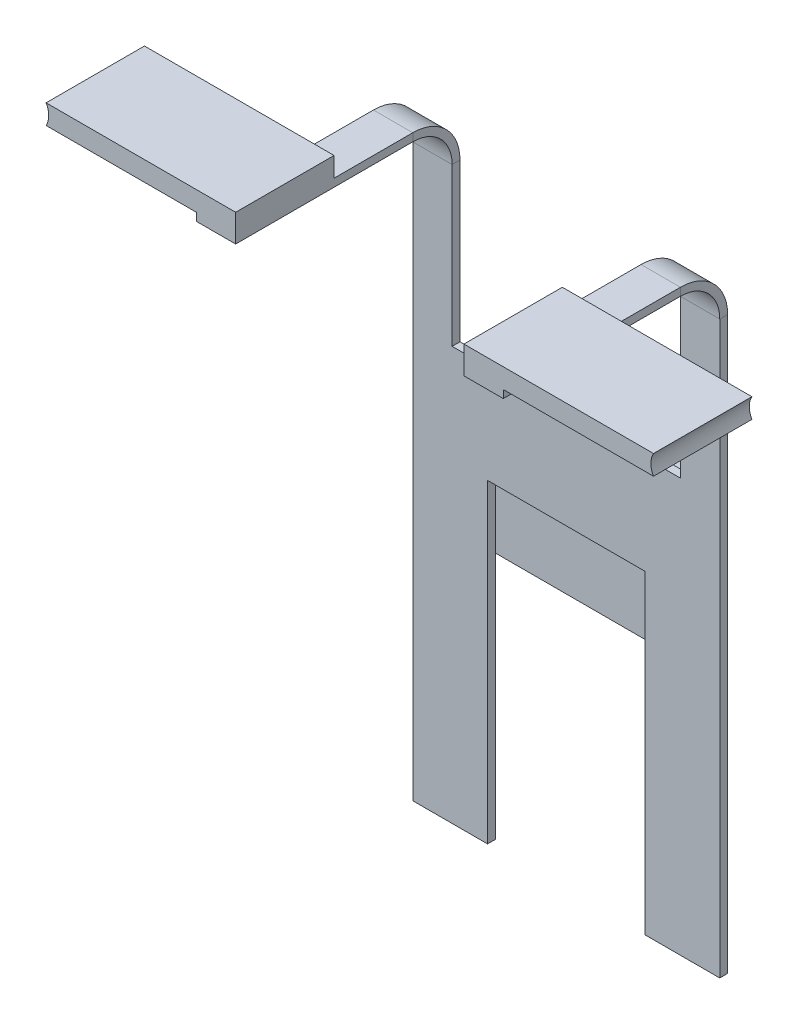
ISO-10303-21;
HEADER;
FILE_DESCRIPTION(('STEP AP214'),'2;1');
FILE_NAME('part.step','',(''),(''),'','','');
FILE_SCHEMA(('AUTOMOTIVE_DESIGN { 1 0 10303 214 1 1 1 1 }'));
ENDSEC;
DATA;
#1=APPLICATION_CONTEXT('core data for automotive mechanical design processes');
#2=APPLICATION_PROTOCOL_DEFINITION('international standard','automotive_design',2000,#1);
#3=PRODUCT_CONTEXT('',#1,'mechanical');
#4=PRODUCT('Part','Part','',(#3));
#5=PRODUCT_RELATED_PRODUCT_CATEGORY('part','',(#4));
#6=PRODUCT_DEFINITION_FORMATION('','',#4);
#7=PRODUCT_DEFINITION_CONTEXT('part definition',#1,'design');
#8=PRODUCT_DEFINITION('design','',#6,#7);
#9=PRODUCT_DEFINITION_SHAPE('','',#8);
#10=(LENGTH_UNIT() NAMED_UNIT(*) SI_UNIT(.MILLI.,.METRE.));
#11=(NAMED_UNIT(*) PLANE_ANGLE_UNIT() SI_UNIT($,.RADIAN.));
#12=(NAMED_UNIT(*) SI_UNIT($,.STERADIAN.) SOLID_ANGLE_UNIT());
#13=UNCERTAINTY_MEASURE_WITH_UNIT(LENGTH_MEASURE(1.E-05),#10,'distance_accuracy_value','');
#14=(GEOMETRIC_REPRESENTATION_CONTEXT(3) GLOBAL_UNCERTAINTY_ASSIGNED_CONTEXT((#13)) GLOBAL_UNIT_ASSIGNED_CONTEXT((#10,
#11,#12)) REPRESENTATION_CONTEXT('',''));
#15=CARTESIAN_POINT('',(0.,0.,0.));
#16=DIRECTION('',(0.,0.,1.));
#17=DIRECTION('',(1.,0.,0.));
#18=AXIS2_PLACEMENT_3D('',#15,#16,#17);
#19=CARTESIAN_POINT('',(78.,154.,24.));
#20=DIRECTION('',(0.,1.,0.));
#21=DIRECTION('',(-1.,0.,0.));
#22=AXIS2_PLACEMENT_3D('',#19,#20,#21);
#23=PLANE('',#22);
#24=DIRECTION('',(0.,0.,1.));
#25=VECTOR('',#24,1.);
#26=CARTESIAN_POINT('',(58.,154.,24.));
#27=LINE('',#26,#25);
#28=CARTESIAN_POINT('',(58.,154.,24.));
#29=VERTEX_POINT('',#28);
#30=CARTESIAN_POINT('',(58.,154.,63.9999999999999));
#31=VERTEX_POINT('',#30);
#32=EDGE_CURVE('E339',#29,#31,#27,.T.);
#33=ORIENTED_EDGE('',*,*,#32,.T.);
#34=DIRECTION('',(1.,0.,0.));
#35=VECTOR('',#34,1.);
#36=CARTESIAN_POINT('',(58.,154.,63.9999999999999));
#37=LINE('',#36,#35);
#38=CARTESIAN_POINT('',(78.,154.,63.9999999999999));
#39=VERTEX_POINT('',#38);
#40=EDGE_CURVE('E276',#31,#39,#37,.T.);
#41=ORIENTED_EDGE('',*,*,#40,.T.);
#42=DIRECTION('',(0.,0.,1.));
#43=VECTOR('',#42,1.);
#44=CARTESIAN_POINT('',(78.,154.,24.));
#45=LINE('',#44,#43);
#46=CARTESIAN_POINT('',(78.,154.,24.));
#47=VERTEX_POINT('',#46);
#48=EDGE_CURVE('E380',#47,#39,#45,.T.);
#49=ORIENTED_EDGE('',*,*,#48,.F.);
#50=DIRECTION('',(-1.,0.,0.));
#51=VECTOR('',#50,1.);
#52=CARTESIAN_POINT('',(78.,154.,24.));
#53=LINE('',#52,#51);
#54=EDGE_CURVE('E347',#47,#29,#53,.T.);
#55=ORIENTED_EDGE('',*,*,#54,.T.);
#56=EDGE_LOOP('',(#33,#41,#49,#55));
#57=FACE_BOUND('',#56,.T.);
#58=ADVANCED_FACE('F39',(#57),#23,.T.);
#59=CARTESIAN_POINT('',(-78.,50.,4.));
#60=DIRECTION('',(0.,-1.,0.));
#61=DIRECTION('',(0.,0.,-1.));
#62=AXIS2_PLACEMENT_3D('',#59,#60,#61);
#63=PLANE('',#62);
#64=DIRECTION('',(0.,0.,1.));
#65=VECTOR('',#64,1.);
#66=CARTESIAN_POINT('',(58.,50.,0.));
#67=LINE('',#66,#65);
#68=CARTESIAN_POINT('',(58.,50.,0.));
#69=VERTEX_POINT('',#68);
#70=CARTESIAN_POINT('',(58.,50.,4.));
#71=VERTEX_POINT('',#70);
#72=EDGE_CURVE('E304',#69,#71,#67,.T.);
#73=ORIENTED_EDGE('',*,*,#72,.F.);
#74=DIRECTION('',(-1.,0.,0.));
#75=VECTOR('',#74,1.);
#76=CARTESIAN_POINT('',(-78.,50.,0.));
#77=LINE('',#76,#75);
#78=CARTESIAN_POINT('',(-58.,50.,0.));
#79=VERTEX_POINT('',#78);
#80=EDGE_CURVE('E571',#69,#79,#77,.T.);
#81=ORIENTED_EDGE('',*,*,#80,.T.);
#82=DIRECTION('',(0.,0.,-1.));
#83=VECTOR('',#82,1.);
#84=CARTESIAN_POINT('',(-58.,50.,4.));
#85=LINE('',#84,#83);
#86=CARTESIAN_POINT('',(-58.,50.,4.));
#87=VERTEX_POINT('',#86);
#88=EDGE_CURVE('E384',#87,#79,#85,.T.);
#89=ORIENTED_EDGE('',*,*,#88,.F.);
#90=DIRECTION('',(-1.,0.,0.));
#91=VECTOR('',#90,1.);
#92=CARTESIAN_POINT('',(-78.,50.,4.));
#93=LINE('',#92,#91);
#94=EDGE_CURVE('E545',#71,#87,#93,.T.);
#95=ORIENTED_EDGE('',*,*,#94,.F.);
#96=EDGE_LOOP('',(#73,#81,#89,#95));
#97=FACE_BOUND('',#96,.T.);
#98=ADVANCED_FACE('F719',(#97),#63,.F.);
#99=CARTESIAN_POINT('',(0.,0.,0.));
#100=DIRECTION('',(0.,0.,1.));
#101=DIRECTION('',(1.,0.,0.));
#102=AXIS2_PLACEMENT_3D('',#99,#100,#101);
#103=PLANE('',#102);
#104=DIRECTION('',(-1.,0.,0.));
#105=VECTOR('',#104,1.);
#106=CARTESIAN_POINT('',(50.,-34.,0.));
#107=LINE('',#106,#105);
#108=CARTESIAN_POINT('',(50.,-34.,0.));
#109=VERTEX_POINT('',#108);
#110=CARTESIAN_POINT('',(40.,-34.,0.));
#111=VERTEX_POINT('',#110);
#112=EDGE_CURVE('E495',#109,#111,#107,.T.);
#113=ORIENTED_EDGE('',*,*,#112,.F.);
#114=DIRECTION('',(0.,-1.,0.));
#115=VECTOR('',#114,1.);
#116=CARTESIAN_POINT('',(50.,38.,0.));
#117=LINE('',#116,#115);
#118=CARTESIAN_POINT('',(50.,38.,0.));
#119=VERTEX_POINT('',#118);
#120=EDGE_CURVE('E475',#119,#109,#117,.T.);
#121=ORIENTED_EDGE('',*,*,#120,.F.);
#122=DIRECTION('',(1.,0.,0.));
#123=VECTOR('',#122,1.);
#124=CARTESIAN_POINT('',(50.,38.,0.));
#125=LINE('',#124,#123);
#126=CARTESIAN_POINT('',(-50.,38.,0.));
#127=VERTEX_POINT('',#126);
#128=EDGE_CURVE('E481',#127,#119,#125,.T.);
#129=ORIENTED_EDGE('',*,*,#128,.F.);
#130=DIRECTION('',(0.,1.,0.));
#131=VECTOR('',#130,1.);
#132=CARTESIAN_POINT('',(-50.,38.,0.));
#133=LINE('',#132,#131);
#134=CARTESIAN_POINT('',(-50.,-34.,0.));
#135=VERTEX_POINT('',#134);
#136=EDGE_CURVE('E499',#135,#127,#133,.T.);
#137=ORIENTED_EDGE('',*,*,#136,.F.);
#138=CARTESIAN_POINT('',(-40.,-34.,0.));
#139=VERTEX_POINT('',#138);
#140=EDGE_CURVE('E254',#139,#135,#107,.T.);
#141=ORIENTED_EDGE('',*,*,#140,.F.);
#142=DIRECTION('',(0.,1.,0.));
#143=VECTOR('',#142,1.);
#144=CARTESIAN_POINT('',(-40.,0.,0.));
#145=LINE('',#144,#143);
#146=CARTESIAN_POINT('',(-40.,-160.,0.));
#147=VERTEX_POINT('',#146);
#148=EDGE_CURVE('E552',#147,#139,#145,.T.);
#149=ORIENTED_EDGE('',*,*,#148,.F.);
#150=DIRECTION('',(1.,0.,0.));
#151=VECTOR('',#150,1.);
#152=CARTESIAN_POINT('',(-78.,-160.,0.));
#153=LINE('',#152,#151);
#154=CARTESIAN_POINT('',(-78.,-160.,0.));
#155=VERTEX_POINT('',#154);
#156=EDGE_CURVE('E521',#155,#147,#153,.T.);
#157=ORIENTED_EDGE('',*,*,#156,.F.);
#158=DIRECTION('',(0.,-1.,0.));
#159=VECTOR('',#158,1.);
#160=CARTESIAN_POINT('',(-78.,0.,0.));
#161=LINE('',#160,#159);
#162=CARTESIAN_POINT('',(-78.,130.,0.));
#163=VERTEX_POINT('',#162);
#164=EDGE_CURVE('E527',#163,#155,#161,.T.);
#165=ORIENTED_EDGE('',*,*,#164,.F.);
#166=DIRECTION('',(-1.,0.,0.));
#167=VECTOR('',#166,1.);
#168=CARTESIAN_POINT('',(-78.,130.,0.));
#169=LINE('',#168,#167);
#170=CARTESIAN_POINT('',(-58.,130.,0.));
#171=VERTEX_POINT('',#170);
#172=EDGE_CURVE('E403',#171,#163,#169,.T.);
#173=ORIENTED_EDGE('',*,*,#172,.F.);
#174=DIRECTION('',(0.,1.,0.));
#175=VECTOR('',#174,1.);
#176=CARTESIAN_POINT('',(-58.,50.,0.));
#177=LINE('',#176,#175);
#178=EDGE_CURVE('E399',#79,#171,#177,.T.);
#179=ORIENTED_EDGE('',*,*,#178,.F.);
#180=ORIENTED_EDGE('',*,*,#80,.F.);
#181=DIRECTION('',(0.,1.,0.));
#182=VECTOR('',#181,1.);
#183=CARTESIAN_POINT('',(58.,50.,0.));
#184=LINE('',#183,#182);
#185=CARTESIAN_POINT('',(58.,130.,0.));
#186=VERTEX_POINT('',#185);
#187=EDGE_CURVE('E308',#69,#186,#184,.T.);
#188=ORIENTED_EDGE('',*,*,#187,.T.);
#189=DIRECTION('',(-1.,0.,0.));
#190=VECTOR('',#189,1.);
#191=CARTESIAN_POINT('',(78.,130.,0.));
#192=LINE('',#191,#190);
#193=CARTESIAN_POINT('',(78.,130.,0.));
#194=VERTEX_POINT('',#193);
#195=EDGE_CURVE('E334',#194,#186,#192,.T.);
#196=ORIENTED_EDGE('',*,*,#195,.F.);
#197=DIRECTION('',(0.,1.,0.));
#198=VECTOR('',#197,1.);
#199=CARTESIAN_POINT('',(78.,0.,0.));
#200=LINE('',#199,#198);
#201=CARTESIAN_POINT('',(78.,-160.,0.));
#202=VERTEX_POINT('',#201);
#203=EDGE_CURVE('E568',#202,#194,#200,.T.);
#204=ORIENTED_EDGE('',*,*,#203,.F.);
#205=DIRECTION('',(1.,0.,0.));
#206=VECTOR('',#205,1.);
#207=CARTESIAN_POINT('',(78.,-160.,0.));
#208=LINE('',#207,#206);
#209=CARTESIAN_POINT('',(40.,-160.,0.));
#210=VERTEX_POINT('',#209);
#211=EDGE_CURVE('E564',#210,#202,#208,.T.);
#212=ORIENTED_EDGE('',*,*,#211,.F.);
#213=DIRECTION('',(0.,-1.,0.));
#214=VECTOR('',#213,1.);
#215=CARTESIAN_POINT('',(40.,0.,0.));
#216=LINE('',#215,#214);
#217=EDGE_CURVE('E559',#111,#210,#216,.T.);
#218=ORIENTED_EDGE('',*,*,#217,.F.);
#219=EDGE_LOOP('',(#113,#121,#129,#137,#141,#149,#157,#165,#173,#179,#180,#188,#196,#204,#212,#218));
#220=FACE_BOUND('',#219,.T.);
#221=ADVANCED_FACE('F627',(#220),#103,.F.);
#222=CARTESIAN_POINT('',(-78.,-160.,4.));
#223=DIRECTION('',(0.,1.,0.));
#224=DIRECTION('',(0.,0.,1.));
#225=AXIS2_PLACEMENT_3D('',#222,#223,#224);
#226=PLANE('',#225);
#227=ORIENTED_EDGE('',*,*,#156,.T.);
#228=DIRECTION('',(0.,0.,-1.));
#229=VECTOR('',#228,1.);
#230=CARTESIAN_POINT('',(-40.,-160.,4.));
#231=LINE('',#230,#229);
#232=CARTESIAN_POINT('',(-40.,-160.,4.));
#233=VERTEX_POINT('',#232);
#234=EDGE_CURVE('E591',#233,#147,#231,.T.);
#235=ORIENTED_EDGE('',*,*,#234,.F.);
#236=DIRECTION('',(1.,0.,0.));
#237=VECTOR('',#236,1.);
#238=CARTESIAN_POINT('',(-78.,-160.,4.));
#239=LINE('',#238,#237);
#240=CARTESIAN_POINT('',(-78.,-160.,4.));
#241=VERTEX_POINT('',#240);
#242=EDGE_CURVE('E526',#241,#233,#239,.T.);
#243=ORIENTED_EDGE('',*,*,#242,.F.);
#244=DIRECTION('',(0.,0.,-1.));
#245=VECTOR('',#244,1.);
#246=CARTESIAN_POINT('',(-78.,-160.,4.));
#247=LINE('',#246,#245);
#248=EDGE_CURVE('E595',#241,#155,#247,.T.);
#249=ORIENTED_EDGE('',*,*,#248,.T.);
#250=EDGE_LOOP('',(#227,#235,#243,#249));
#251=FACE_BOUND('',#250,.T.);
#252=ADVANCED_FACE('F41',(#251),#226,.F.);
#253=CARTESIAN_POINT('',(-40.,0.,4.));
#254=DIRECTION('',(-1.,0.,0.));
#255=DIRECTION('',(0.,-1.,0.));
#256=AXIS2_PLACEMENT_3D('',#253,#254,#255);
#257=PLANE('',#256);
#258=ORIENTED_EDGE('',*,*,#148,.T.);
#259=CARTESIAN_POINT('',(-40.,0.,0.));
#260=VERTEX_POINT('',#259);
#261=EDGE_CURVE('E551',#139,#260,#145,.T.);
#262=ORIENTED_EDGE('',*,*,#261,.T.);
#263=DIRECTION('',(0.,0.,-1.));
#264=VECTOR('',#263,1.);
#265=CARTESIAN_POINT('',(-40.,0.,4.));
#266=LINE('',#265,#264);
#267=CARTESIAN_POINT('',(-40.,0.,4.));
#268=VERTEX_POINT('',#267);
#269=EDGE_CURVE('E587',#268,#260,#266,.T.);
#270=ORIENTED_EDGE('',*,*,#269,.F.);
#271=DIRECTION('',(0.,1.,0.));
#272=VECTOR('',#271,1.);
#273=CARTESIAN_POINT('',(-40.,0.,4.));
#274=LINE('',#273,#272);
#275=EDGE_CURVE('E530',#233,#268,#274,.T.);
#276=ORIENTED_EDGE('',*,*,#275,.F.);
#277=ORIENTED_EDGE('',*,*,#234,.T.);
#278=EDGE_LOOP('',(#258,#262,#270,#276,#277));
#279=FACE_BOUND('',#278,.T.);
#280=ADVANCED_FACE('F808',(#279),#257,.F.);
#281=CARTESIAN_POINT('',(-40.,0.,4.));
#282=DIRECTION('',(0.,1.,0.));
#283=DIRECTION('',(-1.,0.,0.));
#284=AXIS2_PLACEMENT_3D('',#281,#282,#283);
#285=PLANE('',#284);
#286=DIRECTION('',(1.,0.,0.));
#287=VECTOR('',#286,1.);
#288=CARTESIAN_POINT('',(-40.,0.,0.));
#289=LINE('',#288,#287);
#290=CARTESIAN_POINT('',(40.,0.,0.));
#291=VERTEX_POINT('',#290);
#292=EDGE_CURVE('E556',#260,#291,#289,.T.);
#293=ORIENTED_EDGE('',*,*,#292,.T.);
#294=DIRECTION('',(0.,0.,-1.));
#295=VECTOR('',#294,1.);
#296=CARTESIAN_POINT('',(40.,0.,4.));
#297=LINE('',#296,#295);
#298=CARTESIAN_POINT('',(40.,0.,4.));
#299=VERTEX_POINT('',#298);
#300=EDGE_CURVE('E583',#299,#291,#297,.T.);
#301=ORIENTED_EDGE('',*,*,#300,.F.);
#302=DIRECTION('',(1.,0.,0.));
#303=VECTOR('',#302,1.);
#304=CARTESIAN_POINT('',(-40.,0.,4.));
#305=LINE('',#304,#303);
#306=EDGE_CURVE('E533',#268,#299,#305,.T.);
#307=ORIENTED_EDGE('',*,*,#306,.F.);
#308=ORIENTED_EDGE('',*,*,#269,.T.);
#309=EDGE_LOOP('',(#293,#301,#307,#308));
#310=FACE_BOUND('',#309,.T.);
#311=ADVANCED_FACE('F806',(#310),#285,.F.);
#312=CARTESIAN_POINT('',(40.,0.,4.));
#313=DIRECTION('',(1.,0.,0.));
#314=DIRECTION('',(0.,1.,0.));
#315=AXIS2_PLACEMENT_3D('',#312,#313,#314);
#316=PLANE('',#315);
#317=EDGE_CURVE('E560',#291,#111,#216,.T.);
#318=ORIENTED_EDGE('',*,*,#317,.T.);
#319=ORIENTED_EDGE('',*,*,#217,.T.);
#320=DIRECTION('',(0.,0.,-1.));
#321=VECTOR('',#320,1.);
#322=CARTESIAN_POINT('',(40.,-160.,4.));
#323=LINE('',#322,#321);
#324=CARTESIAN_POINT('',(40.,-160.,4.));
#325=VERTEX_POINT('',#324);
#326=EDGE_CURVE('E579',#325,#210,#323,.T.);
#327=ORIENTED_EDGE('',*,*,#326,.F.);
#328=DIRECTION('',(0.,-1.,0.));
#329=VECTOR('',#328,1.);
#330=CARTESIAN_POINT('',(40.,0.,4.));
#331=LINE('',#330,#329);
#332=EDGE_CURVE('E536',#299,#325,#331,.T.);
#333=ORIENTED_EDGE('',*,*,#332,.F.);
#334=ORIENTED_EDGE('',*,*,#300,.T.);
#335=EDGE_LOOP('',(#318,#319,#327,#333,#334));
#336=FACE_BOUND('',#335,.T.);
#337=ADVANCED_FACE('F619',(#336),#316,.F.);
#338=CARTESIAN_POINT('',(78.,-160.,4.));
#339=DIRECTION('',(0.,1.,0.));
#340=DIRECTION('',(0.,0.,1.));
#341=AXIS2_PLACEMENT_3D('',#338,#339,#340);
#342=PLANE('',#341);
#343=ORIENTED_EDGE('',*,*,#211,.T.);
#344=DIRECTION('',(0.,0.,-1.));
#345=VECTOR('',#344,1.);
#346=CARTESIAN_POINT('',(78.,-160.,4.));
#347=LINE('',#346,#345);
#348=CARTESIAN_POINT('',(78.,-160.,4.));
#349=VERTEX_POINT('',#348);
#350=EDGE_CURVE('E548',#349,#202,#347,.T.);
#351=ORIENTED_EDGE('',*,*,#350,.F.);
#352=DIRECTION('',(1.,0.,0.));
#353=VECTOR('',#352,1.);
#354=CARTESIAN_POINT('',(78.,-160.,4.));
#355=LINE('',#354,#353);
#356=EDGE_CURVE('E539',#325,#349,#355,.T.);
#357=ORIENTED_EDGE('',*,*,#356,.F.);
#358=ORIENTED_EDGE('',*,*,#326,.T.);
#359=EDGE_LOOP('',(#343,#351,#357,#358));
#360=FACE_BOUND('',#359,.T.);
#361=ADVANCED_FACE('F625',(#360),#342,.F.);
#362=CARTESIAN_POINT('',(78.,0.,4.));
#363=DIRECTION('',(-1.,0.,0.));
#364=DIRECTION('',(0.,0.,1.));
#365=AXIS2_PLACEMENT_3D('',#362,#363,#364);
#366=PLANE('',#365);
#367=ORIENTED_EDGE('',*,*,#203,.T.);
#368=DIRECTION('',(0.,0.,-1.));
#369=VECTOR('',#368,1.);
#370=CARTESIAN_POINT('',(78.,130.,0.));
#371=LINE('',#370,#369);
#372=CARTESIAN_POINT('',(78.,130.,4.));
#373=VERTEX_POINT('',#372);
#374=EDGE_CURVE('E351',#373,#194,#371,.T.);
#375=ORIENTED_EDGE('',*,*,#374,.F.);
#376=DIRECTION('',(0.,1.,0.));
#377=VECTOR('',#376,1.);
#378=CARTESIAN_POINT('',(78.,0.,4.));
#379=LINE('',#378,#377);
#380=EDGE_CURVE('E542',#349,#373,#379,.T.);
#381=ORIENTED_EDGE('',*,*,#380,.F.);
#382=ORIENTED_EDGE('',*,*,#350,.T.);
#383=EDGE_LOOP('',(#367,#375,#381,#382));
#384=FACE_BOUND('',#383,.T.);
#385=ADVANCED_FACE('F632',(#384),#366,.F.);
#386=CARTESIAN_POINT('',(-78.,0.,4.));
#387=DIRECTION('',(1.,0.,0.));
#388=DIRECTION('',(0.,0.,-1.));
#389=AXIS2_PLACEMENT_3D('',#386,#387,#388);
#390=PLANE('',#389);
#391=ORIENTED_EDGE('',*,*,#164,.T.);
#392=ORIENTED_EDGE('',*,*,#248,.F.);
#393=DIRECTION('',(0.,-1.,0.));
#394=VECTOR('',#393,1.);
#395=CARTESIAN_POINT('',(-78.,0.,4.));
#396=LINE('',#395,#394);
#397=CARTESIAN_POINT('',(-78.,130.,4.));
#398=VERTEX_POINT('',#397);
#399=EDGE_CURVE('E522',#398,#241,#396,.T.);
#400=ORIENTED_EDGE('',*,*,#399,.F.);
#401=DIRECTION('',(0.,0.,1.));
#402=VECTOR('',#401,1.);
#403=CARTESIAN_POINT('',(-78.,130.,4.));
#404=LINE('',#403,#402);
#405=EDGE_CURVE('E437',#163,#398,#404,.T.);
#406=ORIENTED_EDGE('',*,*,#405,.F.);
#407=EDGE_LOOP('',(#391,#392,#400,#406));
#408=FACE_BOUND('',#407,.T.);
#409=ADVANCED_FACE('F793',(#408),#390,.F.);
#410=CARTESIAN_POINT('',(0.,0.,4.));
#411=DIRECTION('',(0.,0.,1.));
#412=DIRECTION('',(1.,0.,0.));
#413=AXIS2_PLACEMENT_3D('',#410,#411,#412);
#414=PLANE('',#413);
#415=ORIENTED_EDGE('',*,*,#399,.T.);
#416=ORIENTED_EDGE('',*,*,#242,.T.);
#417=ORIENTED_EDGE('',*,*,#275,.T.);
#418=ORIENTED_EDGE('',*,*,#306,.T.);
#419=ORIENTED_EDGE('',*,*,#332,.T.);
#420=ORIENTED_EDGE('',*,*,#356,.T.);
#421=ORIENTED_EDGE('',*,*,#380,.T.);
#422=DIRECTION('',(1.,0.,0.));
#423=VECTOR('',#422,1.);
#424=CARTESIAN_POINT('',(78.,130.,4.));
#425=LINE('',#424,#423);
#426=CARTESIAN_POINT('',(58.,130.,4.));
#427=VERTEX_POINT('',#426);
#428=EDGE_CURVE('E317',#427,#373,#425,.T.);
#429=ORIENTED_EDGE('',*,*,#428,.F.);
#430=DIRECTION('',(0.,1.,0.));
#431=VECTOR('',#430,1.);
#432=CARTESIAN_POINT('',(58.,50.,4.));
#433=LINE('',#432,#431);
#434=EDGE_CURVE('E313',#71,#427,#433,.T.);
#435=ORIENTED_EDGE('',*,*,#434,.F.);
#436=ORIENTED_EDGE('',*,*,#94,.T.);
#437=DIRECTION('',(0.,1.,0.));
#438=VECTOR('',#437,1.);
#439=CARTESIAN_POINT('',(-58.,50.,4.));
#440=LINE('',#439,#438);
#441=CARTESIAN_POINT('',(-58.,130.,4.));
#442=VERTEX_POINT('',#441);
#443=EDGE_CURVE('E394',#87,#442,#440,.T.);
#444=ORIENTED_EDGE('',*,*,#443,.T.);
#445=DIRECTION('',(1.,0.,0.));
#446=VECTOR('',#445,1.);
#447=CARTESIAN_POINT('',(-78.,130.,4.));
#448=LINE('',#447,#446);
#449=EDGE_CURVE('E420',#398,#442,#448,.T.);
#450=ORIENTED_EDGE('',*,*,#449,.F.);
#451=EDGE_LOOP('',(#415,#416,#417,#418,#419,#420,#421,#429,#435,#436,#444,#450));
#452=FACE_BOUND('',#451,.T.);
#453=ADVANCED_FACE('F789',(#452),#414,.T.);
#454=CARTESIAN_POINT('',(50.,38.,-20.));
#455=DIRECTION('',(-1.,0.,0.));
#456=DIRECTION('',(0.,0.,1.));
#457=AXIS2_PLACEMENT_3D('',#454,#455,#456);
#458=PLANE('',#457);
#459=ORIENTED_EDGE('',*,*,#120,.T.);
#460=DIRECTION('',(0.,0.,1.));
#461=VECTOR('',#460,1.);
#462=CARTESIAN_POINT('',(50.,-34.,-20.));
#463=LINE('',#462,#461);
#464=CARTESIAN_POINT('',(50.,-34.,-20.));
#465=VERTEX_POINT('',#464);
#466=EDGE_CURVE('E517',#465,#109,#463,.T.);
#467=ORIENTED_EDGE('',*,*,#466,.F.);
#468=DIRECTION('',(0.,-1.,0.));
#469=VECTOR('',#468,1.);
#470=CARTESIAN_POINT('',(50.,38.,-20.));
#471=LINE('',#470,#469);
#472=CARTESIAN_POINT('',(50.,38.,-20.));
#473=VERTEX_POINT('',#472);
#474=EDGE_CURVE('E476',#473,#465,#471,.T.);
#475=ORIENTED_EDGE('',*,*,#474,.F.);
#476=DIRECTION('',(0.,0.,1.));
#477=VECTOR('',#476,1.);
#478=CARTESIAN_POINT('',(50.,38.,-20.));
#479=LINE('',#478,#477);
#480=EDGE_CURVE('E490',#473,#119,#479,.T.);
#481=ORIENTED_EDGE('',*,*,#480,.T.);
#482=EDGE_LOOP('',(#459,#467,#475,#481));
#483=FACE_BOUND('',#482,.T.);
#484=ADVANCED_FACE('F786',(#483),#458,.F.);
#485=CARTESIAN_POINT('',(50.,-34.,-20.));
#486=DIRECTION('',(0.,1.,0.));
#487=DIRECTION('',(0.,0.,1.));
#488=AXIS2_PLACEMENT_3D('',#485,#486,#487);
#489=PLANE('',#488);
#490=ORIENTED_EDGE('',*,*,#112,.T.);
#491=EDGE_CURVE('E494',#111,#139,#107,.T.);
#492=ORIENTED_EDGE('',*,*,#491,.T.);
#493=ORIENTED_EDGE('',*,*,#140,.T.);
#494=DIRECTION('',(0.,0.,1.));
#495=VECTOR('',#494,1.);
#496=CARTESIAN_POINT('',(-50.,-34.,-20.));
#497=LINE('',#496,#495);
#498=CARTESIAN_POINT('',(-50.,-34.,-20.));
#499=VERTEX_POINT('',#498);
#500=EDGE_CURVE('E513',#499,#135,#497,.T.);
#501=ORIENTED_EDGE('',*,*,#500,.F.);
#502=DIRECTION('',(-1.,0.,0.));
#503=VECTOR('',#502,1.);
#504=CARTESIAN_POINT('',(50.,-34.,-20.));
#505=LINE('',#504,#503);
#506=EDGE_CURVE('E480',#465,#499,#505,.T.);
#507=ORIENTED_EDGE('',*,*,#506,.F.);
#508=ORIENTED_EDGE('',*,*,#466,.T.);
#509=EDGE_LOOP('',(#490,#492,#493,#501,#507,#508));
#510=FACE_BOUND('',#509,.T.);
#511=ADVANCED_FACE('F607',(#510),#489,.F.);
#512=CARTESIAN_POINT('',(-50.,38.,-20.));
#513=DIRECTION('',(1.,0.,0.));
#514=DIRECTION('',(0.,1.,0.));
#515=AXIS2_PLACEMENT_3D('',#512,#513,#514);
#516=PLANE('',#515);
#517=ORIENTED_EDGE('',*,*,#136,.T.);
#518=DIRECTION('',(0.,0.,1.));
#519=VECTOR('',#518,1.);
#520=CARTESIAN_POINT('',(-50.,38.,-20.));
#521=LINE('',#520,#519);
#522=CARTESIAN_POINT('',(-50.,38.,-20.));
#523=VERTEX_POINT('',#522);
#524=EDGE_CURVE('E509',#523,#127,#521,.T.);
#525=ORIENTED_EDGE('',*,*,#524,.F.);
#526=DIRECTION('',(0.,1.,0.));
#527=VECTOR('',#526,1.);
#528=CARTESIAN_POINT('',(-50.,38.,-20.));
#529=LINE('',#528,#527);
#530=EDGE_CURVE('E484',#499,#523,#529,.T.);
#531=ORIENTED_EDGE('',*,*,#530,.F.);
#532=ORIENTED_EDGE('',*,*,#500,.T.);
#533=EDGE_LOOP('',(#517,#525,#531,#532));
#534=FACE_BOUND('',#533,.T.);
#535=ADVANCED_FACE('F779',(#534),#516,.F.);
#536=CARTESIAN_POINT('',(50.,38.,-20.));
#537=DIRECTION('',(0.,-1.,0.));
#538=DIRECTION('',(0.,0.,-1.));
#539=AXIS2_PLACEMENT_3D('',#536,#537,#538);
#540=PLANE('',#539);
#541=ORIENTED_EDGE('',*,*,#128,.T.);
#542=ORIENTED_EDGE('',*,*,#480,.F.);
#543=DIRECTION('',(1.,0.,0.));
#544=VECTOR('',#543,1.);
#545=CARTESIAN_POINT('',(50.,38.,-20.));
#546=LINE('',#545,#544);
#547=EDGE_CURVE('E487',#523,#473,#546,.T.);
#548=ORIENTED_EDGE('',*,*,#547,.F.);
#549=ORIENTED_EDGE('',*,*,#524,.T.);
#550=EDGE_LOOP('',(#541,#542,#548,#549));
#551=FACE_BOUND('',#550,.T.);
#552=ADVANCED_FACE('F773',(#551),#540,.F.);
#553=CARTESIAN_POINT('',(0.,0.,-20.));
#554=DIRECTION('',(0.,0.,-1.));
#555=DIRECTION('',(-1.,0.,0.));
#556=AXIS2_PLACEMENT_3D('',#553,#554,#555);
#557=PLANE('',#556);
#558=ORIENTED_EDGE('',*,*,#474,.T.);
#559=ORIENTED_EDGE('',*,*,#506,.T.);
#560=ORIENTED_EDGE('',*,*,#530,.T.);
#561=ORIENTED_EDGE('',*,*,#547,.T.);
#562=EDGE_LOOP('',(#558,#559,#560,#561));
#563=FACE_BOUND('',#562,.T.);
#564=ADVANCED_FACE('F770',(#563),#557,.T.);
#565=CARTESIAN_POINT('',(0.,0.,0.));
#566=DIRECTION('',(0.,0.,-1.));
#567=DIRECTION('',(-1.,0.,0.));
#568=AXIS2_PLACEMENT_3D('',#565,#566,#567);
#569=PLANE('',#568);
#570=ORIENTED_EDGE('',*,*,#317,.F.);
#571=ORIENTED_EDGE('',*,*,#292,.F.);
#572=ORIENTED_EDGE('',*,*,#261,.F.);
#573=ORIENTED_EDGE('',*,*,#491,.F.);
#574=EDGE_LOOP('',(#570,#571,#572,#573));
#575=FACE_BOUND('',#574,.T.);
#576=ADVANCED_FACE('F611',(#575),#569,.F.);
#577=CARTESIAN_POINT('',(0.,154.,114.));
#578=DIRECTION('',(0.,0.,-1.));
#579=DIRECTION('',(0.,1.,0.));
#580=AXIS2_PLACEMENT_3D('',#577,#578,#579);
#581=PLANE('',#580);
#582=DIRECTION('',(-1.,0.,0.));
#583=VECTOR('',#582,1.);
#584=CARTESIAN_POINT('',(-58.,164.,114.));
#585=LINE('',#584,#583);
#586=CARTESIAN_POINT('',(-58.,164.,114.));
#587=VERTEX_POINT('',#586);
#588=CARTESIAN_POINT('',(-154.339745962156,164.,114.));
#589=VERTEX_POINT('',#588);
#590=EDGE_CURVE('E288',#587,#589,#585,.T.);
#591=ORIENTED_EDGE('',*,*,#590,.T.);
#592=CARTESIAN_POINT('',(-163.,159.,114.));
#593=DIRECTION('',(0.,0.,1.));
#594=DIRECTION('',(1.,0.,0.));
#595=AXIS2_PLACEMENT_3D('',#592,#593,#594);
#596=CIRCLE('',#595,10.);
#597=CARTESIAN_POINT('',(-154.339745962156,154.,114.));
#598=VERTEX_POINT('',#597);
#599=EDGE_CURVE('E55',#598,#589,#596,.T.);
#600=ORIENTED_EDGE('',*,*,#599,.F.);
#601=DIRECTION('',(-1.,0.,0.));
#602=VECTOR('',#601,1.);
#603=CARTESIAN_POINT('',(-58.,154.,114.));
#604=LINE('',#603,#602);
#605=CARTESIAN_POINT('',(-78.,154.,114.));
#606=VERTEX_POINT('',#605);
#607=EDGE_CURVE('E300',#606,#598,#604,.T.);
#608=ORIENTED_EDGE('',*,*,#607,.F.);
#609=DIRECTION('',(0.,-1.,0.));
#610=VECTOR('',#609,1.);
#611=CARTESIAN_POINT('',(-78.,150.,114.));
#612=LINE('',#611,#610);
#613=CARTESIAN_POINT('',(-78.,150.,114.));
#614=VERTEX_POINT('',#613);
#615=EDGE_CURVE('E449',#606,#614,#612,.T.);
#616=ORIENTED_EDGE('',*,*,#615,.T.);
#617=DIRECTION('',(1.,0.,0.));
#618=VECTOR('',#617,1.);
#619=CARTESIAN_POINT('',(-78.,150.,114.));
#620=LINE('',#619,#618);
#621=CARTESIAN_POINT('',(-58.,150.,114.));
#622=VERTEX_POINT('',#621);
#623=EDGE_CURVE('E466',#614,#622,#620,.T.);
#624=ORIENTED_EDGE('',*,*,#623,.T.);
#625=DIRECTION('',(0.,1.,0.));
#626=VECTOR('',#625,1.);
#627=CARTESIAN_POINT('',(-58.,150.,114.));
#628=LINE('',#627,#626);
#629=EDGE_CURVE('E421',#622,#587,#628,.T.);
#630=ORIENTED_EDGE('',*,*,#629,.T.);
#631=EDGE_LOOP('',(#591,#600,#608,#616,#624,#630));
#632=FACE_BOUND('',#631,.T.);
#633=ADVANCED_FACE('F705',(#632),#581,.F.);
#634=CARTESIAN_POINT('',(-58.,50.,4.));
#635=DIRECTION('',(1.,0.,0.));
#636=DIRECTION('',(0.,0.,-1.));
#637=AXIS2_PLACEMENT_3D('',#634,#635,#636);
#638=PLANE('',#637);
#639=ORIENTED_EDGE('',*,*,#178,.T.);
#640=DIRECTION('',(0.,0.,-1.));
#641=VECTOR('',#640,1.);
#642=CARTESIAN_POINT('',(-58.,130.,4.));
#643=LINE('',#642,#641);
#644=EDGE_CURVE('E395',#442,#171,#643,.T.);
#645=ORIENTED_EDGE('',*,*,#644,.F.);
#646=ORIENTED_EDGE('',*,*,#443,.F.);
#647=ORIENTED_EDGE('',*,*,#88,.T.);
#648=EDGE_LOOP('',(#639,#645,#646,#647));
#649=FACE_BOUND('',#648,.T.);
#650=ADVANCED_FACE('F735',(#649),#638,.T.);
#651=CARTESIAN_POINT('',(-58.,130.,4.));
#652=DIRECTION('',(1.,0.,0.));
#653=DIRECTION('',(0.,0.,-1.));
#654=AXIS2_PLACEMENT_3D('',#651,#652,#653);
#655=PLANE('',#654);
#656=CARTESIAN_POINT('',(-58.,130.,24.));
#657=DIRECTION('',(1.,0.,0.));
#658=DIRECTION('',(0.,0.,-1.));
#659=AXIS2_PLACEMENT_3D('',#656,#657,#658);
#660=CIRCLE('',#659,24.);
#661=CARTESIAN_POINT('',(-58.,154.,24.));
#662=VERTEX_POINT('',#661);
#663=EDGE_CURVE('E411',#171,#662,#660,.T.);
#664=ORIENTED_EDGE('',*,*,#663,.T.);
#665=DIRECTION('',(0.,1.,0.));
#666=VECTOR('',#665,1.);
#667=CARTESIAN_POINT('',(-58.,150.,24.));
#668=LINE('',#667,#666);
#669=CARTESIAN_POINT('',(-58.,150.,24.));
#670=VERTEX_POINT('',#669);
#671=EDGE_CURVE('E407',#670,#662,#668,.T.);
#672=ORIENTED_EDGE('',*,*,#671,.F.);
#673=CARTESIAN_POINT('',(-58.,130.,24.));
#674=DIRECTION('',(1.,0.,0.));
#675=DIRECTION('',(0.,0.,-1.));
#676=AXIS2_PLACEMENT_3D('',#673,#674,#675);
#677=CIRCLE('',#676,20.);
#678=EDGE_CURVE('E412',#442,#670,#677,.T.);
#679=ORIENTED_EDGE('',*,*,#678,.F.);
#680=ORIENTED_EDGE('',*,*,#644,.T.);
#681=EDGE_LOOP('',(#664,#672,#679,#680));
#682=FACE_BOUND('',#681,.T.);
#683=ADVANCED_FACE('F738',(#682),#655,.T.);
#684=CARTESIAN_POINT('',(-78.,130.,24.));
#685=DIRECTION('',(1.,0.,0.));
#686=DIRECTION('',(0.,0.,-1.));
#687=AXIS2_PLACEMENT_3D('',#684,#685,#686);
#688=CYLINDRICAL_SURFACE('',#687,24.);
#689=CARTESIAN_POINT('',(-78.,130.,24.));
#690=DIRECTION('',(1.,0.,0.));
#691=DIRECTION('',(0.,0.,-1.));
#692=AXIS2_PLACEMENT_3D('',#689,#690,#691);
#693=CIRCLE('',#692,24.);
#694=CARTESIAN_POINT('',(-78.,154.,24.));
#695=VERTEX_POINT('',#694);
#696=EDGE_CURVE('E441',#163,#695,#693,.T.);
#697=ORIENTED_EDGE('',*,*,#696,.T.);
#698=DIRECTION('',(-1.,0.,0.));
#699=VECTOR('',#698,1.);
#700=CARTESIAN_POINT('',(-78.,154.,24.));
#701=LINE('',#700,#699);
#702=EDGE_CURVE('E416',#662,#695,#701,.T.);
#703=ORIENTED_EDGE('',*,*,#702,.F.);
#704=ORIENTED_EDGE('',*,*,#663,.F.);
#705=ORIENTED_EDGE('',*,*,#172,.T.);
#706=EDGE_LOOP('',(#697,#703,#704,#705));
#707=FACE_BOUND('',#706,.T.);
#708=ADVANCED_FACE('F742',(#707),#688,.T.);
#709=CARTESIAN_POINT('',(-78.,130.,4.));
#710=DIRECTION('',(-1.,0.,0.));
#711=DIRECTION('',(0.,0.,1.));
#712=AXIS2_PLACEMENT_3D('',#709,#710,#711);
#713=PLANE('',#712);
#714=CARTESIAN_POINT('',(-78.,130.,24.));
#715=DIRECTION('',(1.,0.,0.));
#716=DIRECTION('',(0.,0.,-1.));
#717=AXIS2_PLACEMENT_3D('',#714,#715,#716);
#718=CIRCLE('',#717,20.);
#719=CARTESIAN_POINT('',(-78.,150.,24.));
#720=VERTEX_POINT('',#719);
#721=EDGE_CURVE('E456',#398,#720,#718,.T.);
#722=ORIENTED_EDGE('',*,*,#721,.T.);
#723=DIRECTION('',(0.,-1.,0.));
#724=VECTOR('',#723,1.);
#725=CARTESIAN_POINT('',(-78.,150.,24.));
#726=LINE('',#725,#724);
#727=EDGE_CURVE('E445',#695,#720,#726,.T.);
#728=ORIENTED_EDGE('',*,*,#727,.F.);
#729=ORIENTED_EDGE('',*,*,#696,.F.);
#730=ORIENTED_EDGE('',*,*,#405,.T.);
#731=EDGE_LOOP('',(#722,#728,#729,#730));
#732=FACE_BOUND('',#731,.T.);
#733=ADVANCED_FACE('F752',(#732),#713,.T.);
#734=CARTESIAN_POINT('',(-78.,130.,24.));
#735=DIRECTION('',(1.,0.,0.));
#736=DIRECTION('',(0.,0.,-1.));
#737=AXIS2_PLACEMENT_3D('',#734,#735,#736);
#738=CYLINDRICAL_SURFACE('',#737,20.);
#739=DIRECTION('',(1.,0.,0.));
#740=VECTOR('',#739,1.);
#741=CARTESIAN_POINT('',(-78.,150.,24.));
#742=LINE('',#741,#740);
#743=EDGE_CURVE('E433',#720,#670,#742,.T.);
#744=ORIENTED_EDGE('',*,*,#743,.F.);
#745=ORIENTED_EDGE('',*,*,#721,.F.);
#746=ORIENTED_EDGE('',*,*,#449,.T.);
#747=ORIENTED_EDGE('',*,*,#678,.T.);
#748=EDGE_LOOP('',(#744,#745,#746,#747));
#749=FACE_BOUND('',#748,.T.);
#750=ADVANCED_FACE('F748',(#749),#738,.F.);
#751=CARTESIAN_POINT('',(-58.,150.,24.));
#752=DIRECTION('',(1.,0.,0.));
#753=DIRECTION('',(0.,1.,0.));
#754=AXIS2_PLACEMENT_3D('',#751,#752,#753);
#755=PLANE('',#754);
#756=DIRECTION('',(0.,0.,1.));
#757=VECTOR('',#756,1.);
#758=CARTESIAN_POINT('',(-58.,154.,24.));
#759=LINE('',#758,#757);
#760=CARTESIAN_POINT('',(-58.,154.,63.9999999999999));
#761=VERTEX_POINT('',#760);
#762=EDGE_CURVE('E424',#662,#761,#759,.T.);
#763=ORIENTED_EDGE('',*,*,#762,.T.);
#764=DIRECTION('',(0.,1.,0.));
#765=VECTOR('',#764,1.);
#766=CARTESIAN_POINT('',(-58.,154.,63.9999999999999));
#767=LINE('',#766,#765);
#768=CARTESIAN_POINT('',(-58.,164.,63.9999999999999));
#769=VERTEX_POINT('',#768);
#770=EDGE_CURVE('E269',#761,#769,#767,.T.);
#771=ORIENTED_EDGE('',*,*,#770,.T.);
#772=DIRECTION('',(0.,0.,1.));
#773=VECTOR('',#772,1.);
#774=CARTESIAN_POINT('',(-58.,164.,114.));
#775=LINE('',#774,#773);
#776=EDGE_CURVE('E274',#769,#587,#775,.T.);
#777=ORIENTED_EDGE('',*,*,#776,.T.);
#778=ORIENTED_EDGE('',*,*,#629,.F.);
#779=DIRECTION('',(0.,0.,1.));
#780=VECTOR('',#779,1.);
#781=CARTESIAN_POINT('',(-58.,150.,24.));
#782=LINE('',#781,#780);
#783=EDGE_CURVE('E425',#670,#622,#782,.T.);
#784=ORIENTED_EDGE('',*,*,#783,.F.);
#785=ORIENTED_EDGE('',*,*,#671,.T.);
#786=EDGE_LOOP('',(#763,#771,#777,#778,#784,#785));
#787=FACE_BOUND('',#786,.T.);
#788=ADVANCED_FACE('F744',(#787),#755,.T.);
#789=CARTESIAN_POINT('',(-78.,154.,24.));
#790=DIRECTION('',(0.,1.,0.));
#791=DIRECTION('',(0.,0.,1.));
#792=AXIS2_PLACEMENT_3D('',#789,#790,#791);
#793=PLANE('',#792);
#794=DIRECTION('',(-1.,0.,0.));
#795=VECTOR('',#794,1.);
#796=CARTESIAN_POINT('',(-58.,154.,63.9999999999999));
#797=LINE('',#796,#795);
#798=CARTESIAN_POINT('',(-78.,154.,63.9999999999999));
#799=VERTEX_POINT('',#798);
#800=EDGE_CURVE('E289',#761,#799,#797,.T.);
#801=ORIENTED_EDGE('',*,*,#800,.F.);
#802=ORIENTED_EDGE('',*,*,#762,.F.);
#803=ORIENTED_EDGE('',*,*,#702,.T.);
#804=DIRECTION('',(0.,0.,1.));
#805=VECTOR('',#804,1.);
#806=CARTESIAN_POINT('',(-78.,154.,24.));
#807=LINE('',#806,#805);
#808=EDGE_CURVE('E446',#695,#799,#807,.T.);
#809=ORIENTED_EDGE('',*,*,#808,.T.);
#810=EDGE_LOOP('',(#801,#802,#803,#809));
#811=FACE_BOUND('',#810,.T.);
#812=ADVANCED_FACE('F747',(#811),#793,.T.);
#813=CARTESIAN_POINT('',(-78.,150.,24.));
#814=DIRECTION('',(-1.,0.,0.));
#815=DIRECTION('',(0.,0.,1.));
#816=AXIS2_PLACEMENT_3D('',#813,#814,#815);
#817=PLANE('',#816);
#818=DIRECTION('',(0.,0.,1.));
#819=VECTOR('',#818,1.);
#820=CARTESIAN_POINT('',(-78.,150.,24.));
#821=LINE('',#820,#819);
#822=EDGE_CURVE('E462',#720,#614,#821,.T.);
#823=ORIENTED_EDGE('',*,*,#822,.T.);
#824=ORIENTED_EDGE('',*,*,#615,.F.);
#825=EDGE_CURVE('E429',#799,#606,#807,.T.);
#826=ORIENTED_EDGE('',*,*,#825,.F.);
#827=ORIENTED_EDGE('',*,*,#808,.F.);
#828=ORIENTED_EDGE('',*,*,#727,.T.);
#829=EDGE_LOOP('',(#823,#824,#826,#827,#828));
#830=FACE_BOUND('',#829,.T.);
#831=ADVANCED_FACE('F756',(#830),#817,.T.);
#832=CARTESIAN_POINT('',(-78.,150.,24.));
#833=DIRECTION('',(0.,-1.,0.));
#834=DIRECTION('',(0.,0.,-1.));
#835=AXIS2_PLACEMENT_3D('',#832,#833,#834);
#836=PLANE('',#835);
#837=ORIENTED_EDGE('',*,*,#623,.F.);
#838=ORIENTED_EDGE('',*,*,#822,.F.);
#839=ORIENTED_EDGE('',*,*,#743,.T.);
#840=ORIENTED_EDGE('',*,*,#783,.T.);
#841=EDGE_LOOP('',(#837,#838,#839,#840));
#842=FACE_BOUND('',#841,.T.);
#843=ADVANCED_FACE('F734',(#842),#836,.T.);
#844=CARTESIAN_POINT('',(0.,154.,114.));
#845=DIRECTION('',(0.,0.,-1.));
#846=DIRECTION('',(0.,1.,0.));
#847=AXIS2_PLACEMENT_3D('',#844,#845,#846);
#848=PLANE('',#847);
#849=DIRECTION('',(1.,0.,0.));
#850=VECTOR('',#849,1.);
#851=CARTESIAN_POINT('',(58.,154.,114.));
#852=LINE('',#851,#850);
#853=CARTESIAN_POINT('',(78.,154.,114.));
#854=VERTEX_POINT('',#853);
#855=CARTESIAN_POINT('',(154.339745962156,154.,114.));
#856=VERTEX_POINT('',#855);
#857=EDGE_CURVE('E261',#854,#856,#852,.T.);
#858=ORIENTED_EDGE('',*,*,#857,.T.);
#859=CARTESIAN_POINT('',(163.,159.,114.));
#860=DIRECTION('',(0.,0.,1.));
#861=DIRECTION('',(1.,0.,0.));
#862=AXIS2_PLACEMENT_3D('',#859,#860,#861);
#863=CIRCLE('',#862,10.);
#864=CARTESIAN_POINT('',(154.339745962156,164.,114.));
#865=VERTEX_POINT('',#864);
#866=EDGE_CURVE('E247',#865,#856,#863,.T.);
#867=ORIENTED_EDGE('',*,*,#866,.F.);
#868=DIRECTION('',(1.,0.,0.));
#869=VECTOR('',#868,1.);
#870=CARTESIAN_POINT('',(58.,164.,114.));
#871=LINE('',#870,#869);
#872=CARTESIAN_POINT('',(58.,164.,114.));
#873=VERTEX_POINT('',#872);
#874=EDGE_CURVE('E259',#873,#865,#871,.T.);
#875=ORIENTED_EDGE('',*,*,#874,.F.);
#876=DIRECTION('',(0.,-1.,0.));
#877=VECTOR('',#876,1.);
#878=CARTESIAN_POINT('',(58.,154.,114.));
#879=LINE('',#878,#877);
#880=CARTESIAN_POINT('',(58.,150.,114.));
#881=VERTEX_POINT('',#880);
#882=EDGE_CURVE('E335',#873,#881,#879,.T.);
#883=ORIENTED_EDGE('',*,*,#882,.T.);
#884=DIRECTION('',(1.,0.,0.));
#885=VECTOR('',#884,1.);
#886=CARTESIAN_POINT('',(78.,150.,114.));
#887=LINE('',#886,#885);
#888=CARTESIAN_POINT('',(78.,150.,114.));
#889=VERTEX_POINT('',#888);
#890=EDGE_CURVE('E343',#881,#889,#887,.T.);
#891=ORIENTED_EDGE('',*,*,#890,.T.);
#892=DIRECTION('',(0.,1.,0.));
#893=VECTOR('',#892,1.);
#894=CARTESIAN_POINT('',(78.,154.,114.));
#895=LINE('',#894,#893);
#896=EDGE_CURVE('E366',#889,#854,#895,.T.);
#897=ORIENTED_EDGE('',*,*,#896,.T.);
#898=EDGE_LOOP('',(#858,#867,#875,#883,#891,#897));
#899=FACE_BOUND('',#898,.T.);
#900=ADVANCED_FACE('F258',(#899),#848,.F.);
#901=CARTESIAN_POINT('',(58.,50.,0.));
#902=DIRECTION('',(-1.,0.,0.));
#903=DIRECTION('',(0.,0.,1.));
#904=AXIS2_PLACEMENT_3D('',#901,#902,#903);
#905=PLANE('',#904);
#906=ORIENTED_EDGE('',*,*,#434,.T.);
#907=DIRECTION('',(0.,0.,1.));
#908=VECTOR('',#907,1.);
#909=CARTESIAN_POINT('',(58.,130.,0.));
#910=LINE('',#909,#908);
#911=EDGE_CURVE('E309',#186,#427,#910,.T.);
#912=ORIENTED_EDGE('',*,*,#911,.F.);
#913=ORIENTED_EDGE('',*,*,#187,.F.);
#914=ORIENTED_EDGE('',*,*,#72,.T.);
#915=EDGE_LOOP('',(#906,#912,#913,#914));
#916=FACE_BOUND('',#915,.T.);
#917=ADVANCED_FACE('F733',(#916),#905,.T.);
#918=CARTESIAN_POINT('',(58.,130.,0.));
#919=DIRECTION('',(-1.,0.,0.));
#920=DIRECTION('',(0.,0.,1.));
#921=AXIS2_PLACEMENT_3D('',#918,#919,#920);
#922=PLANE('',#921);
#923=CARTESIAN_POINT('',(58.,130.,24.));
#924=DIRECTION('',(1.,0.,0.));
#925=DIRECTION('',(0.,0.,-1.));
#926=AXIS2_PLACEMENT_3D('',#923,#924,#925);
#927=CIRCLE('',#926,20.);
#928=CARTESIAN_POINT('',(58.,150.,24.));
#929=VERTEX_POINT('',#928);
#930=EDGE_CURVE('E325',#427,#929,#927,.T.);
#931=ORIENTED_EDGE('',*,*,#930,.T.);
#932=DIRECTION('',(0.,-1.,0.));
#933=VECTOR('',#932,1.);
#934=CARTESIAN_POINT('',(58.,154.,24.));
#935=LINE('',#934,#933);
#936=EDGE_CURVE('E321',#29,#929,#935,.T.);
#937=ORIENTED_EDGE('',*,*,#936,.F.);
#938=CARTESIAN_POINT('',(58.,130.,24.));
#939=DIRECTION('',(1.,0.,0.));
#940=DIRECTION('',(0.,0.,-1.));
#941=AXIS2_PLACEMENT_3D('',#938,#939,#940);
#942=CIRCLE('',#941,24.);
#943=EDGE_CURVE('E326',#186,#29,#942,.T.);
#944=ORIENTED_EDGE('',*,*,#943,.F.);
#945=ORIENTED_EDGE('',*,*,#911,.T.);
#946=EDGE_LOOP('',(#931,#937,#944,#945));
#947=FACE_BOUND('',#946,.T.);
#948=ADVANCED_FACE('F655',(#947),#922,.T.);
#949=CARTESIAN_POINT('',(-78.,130.,24.));
#950=DIRECTION('',(1.,0.,0.));
#951=DIRECTION('',(0.,0.,-1.));
#952=AXIS2_PLACEMENT_3D('',#949,#950,#951);
#953=CYLINDRICAL_SURFACE('',#952,20.);
#954=CARTESIAN_POINT('',(78.,130.,24.));
#955=DIRECTION('',(1.,0.,0.));
#956=DIRECTION('',(0.,0.,-1.));
#957=AXIS2_PLACEMENT_3D('',#954,#955,#956);
#958=CIRCLE('',#957,20.);
#959=CARTESIAN_POINT('',(78.,150.,24.));
#960=VERTEX_POINT('',#959);
#961=EDGE_CURVE('E355',#373,#960,#958,.T.);
#962=ORIENTED_EDGE('',*,*,#961,.T.);
#963=DIRECTION('',(1.,0.,0.));
#964=VECTOR('',#963,1.);
#965=CARTESIAN_POINT('',(78.,150.,24.));
#966=LINE('',#965,#964);
#967=EDGE_CURVE('E330',#929,#960,#966,.T.);
#968=ORIENTED_EDGE('',*,*,#967,.F.);
#969=ORIENTED_EDGE('',*,*,#930,.F.);
#970=ORIENTED_EDGE('',*,*,#428,.T.);
#971=EDGE_LOOP('',(#962,#968,#969,#970));
#972=FACE_BOUND('',#971,.T.);
#973=ADVANCED_FACE('F651',(#972),#953,.F.);
#974=CARTESIAN_POINT('',(78.,130.,0.));
#975=DIRECTION('',(1.,0.,0.));
#976=DIRECTION('',(0.,0.,-1.));
#977=AXIS2_PLACEMENT_3D('',#974,#975,#976);
#978=PLANE('',#977);
#979=CARTESIAN_POINT('',(78.,130.,24.));
#980=DIRECTION('',(1.,0.,0.));
#981=DIRECTION('',(0.,0.,-1.));
#982=AXIS2_PLACEMENT_3D('',#979,#980,#981);
#983=CIRCLE('',#982,24.);
#984=EDGE_CURVE('E373',#194,#47,#983,.T.);
#985=ORIENTED_EDGE('',*,*,#984,.T.);
#986=DIRECTION('',(0.,1.,0.));
#987=VECTOR('',#986,1.);
#988=CARTESIAN_POINT('',(78.,154.,24.));
#989=LINE('',#988,#987);
#990=EDGE_CURVE('E359',#960,#47,#989,.T.);
#991=ORIENTED_EDGE('',*,*,#990,.F.);
#992=ORIENTED_EDGE('',*,*,#961,.F.);
#993=ORIENTED_EDGE('',*,*,#374,.T.);
#994=EDGE_LOOP('',(#985,#991,#992,#993));
#995=FACE_BOUND('',#994,.T.);
#996=ADVANCED_FACE('F640',(#995),#978,.T.);
#997=CARTESIAN_POINT('',(-78.,130.,24.));
#998=DIRECTION('',(1.,0.,0.));
#999=DIRECTION('',(0.,0.,-1.));
#1000=AXIS2_PLACEMENT_3D('',#997,#998,#999);
#1001=CYLINDRICAL_SURFACE('',#1000,24.);
#1002=ORIENTED_EDGE('',*,*,#54,.F.);
#1003=ORIENTED_EDGE('',*,*,#984,.F.);
#1004=ORIENTED_EDGE('',*,*,#195,.T.);
#1005=ORIENTED_EDGE('',*,*,#943,.T.);
#1006=EDGE_LOOP('',(#1002,#1003,#1004,#1005));
#1007=FACE_BOUND('',#1006,.T.);
#1008=ADVANCED_FACE('F636',(#1007),#1001,.T.);
#1009=CARTESIAN_POINT('',(58.,154.,24.));
#1010=DIRECTION('',(-1.,0.,0.));
#1011=DIRECTION('',(0.,0.,1.));
#1012=AXIS2_PLACEMENT_3D('',#1009,#1010,#1011);
#1013=PLANE('',#1012);
#1014=DIRECTION('',(0.,0.,1.));
#1015=VECTOR('',#1014,1.);
#1016=CARTESIAN_POINT('',(58.,150.,24.));
#1017=LINE('',#1016,#1015);
#1018=EDGE_CURVE('E338',#929,#881,#1017,.T.);
#1019=ORIENTED_EDGE('',*,*,#1018,.T.);
#1020=ORIENTED_EDGE('',*,*,#882,.F.);
#1021=DIRECTION('',(0.,0.,-1.));
#1022=VECTOR('',#1021,1.);
#1023=CARTESIAN_POINT('',(58.,164.,63.9999999999999));
#1024=LINE('',#1023,#1022);
#1025=CARTESIAN_POINT('',(58.,164.,63.9999999999999));
#1026=VERTEX_POINT('',#1025);
#1027=EDGE_CURVE('E267',#873,#1026,#1024,.T.);
#1028=ORIENTED_EDGE('',*,*,#1027,.T.);
#1029=DIRECTION('',(0.,-1.,0.));
#1030=VECTOR('',#1029,1.);
#1031=CARTESIAN_POINT('',(58.,164.,63.9999999999999));
#1032=LINE('',#1031,#1030);
#1033=EDGE_CURVE('E282',#1026,#31,#1032,.T.);
#1034=ORIENTED_EDGE('',*,*,#1033,.T.);
#1035=ORIENTED_EDGE('',*,*,#32,.F.);
#1036=ORIENTED_EDGE('',*,*,#936,.T.);
#1037=EDGE_LOOP('',(#1019,#1020,#1028,#1034,#1035,#1036));
#1038=FACE_BOUND('',#1037,.T.);
#1039=ADVANCED_FACE('F657',(#1038),#1013,.T.);
#1040=CARTESIAN_POINT('',(78.,150.,24.));
#1041=DIRECTION('',(0.,-1.,0.));
#1042=DIRECTION('',(0.,0.,-1.));
#1043=AXIS2_PLACEMENT_3D('',#1040,#1041,#1042);
#1044=PLANE('',#1043);
#1045=DIRECTION('',(0.,0.,1.));
#1046=VECTOR('',#1045,1.);
#1047=CARTESIAN_POINT('',(78.,150.,24.));
#1048=LINE('',#1047,#1046);
#1049=EDGE_CURVE('E362',#960,#889,#1048,.T.);
#1050=ORIENTED_EDGE('',*,*,#1049,.T.);
#1051=ORIENTED_EDGE('',*,*,#890,.F.);
#1052=ORIENTED_EDGE('',*,*,#1018,.F.);
#1053=ORIENTED_EDGE('',*,*,#967,.T.);
#1054=EDGE_LOOP('',(#1050,#1051,#1052,#1053));
#1055=FACE_BOUND('',#1054,.T.);
#1056=ADVANCED_FACE('F648',(#1055),#1044,.T.);
#1057=CARTESIAN_POINT('',(78.,154.,24.));
#1058=DIRECTION('',(1.,0.,0.));
#1059=DIRECTION('',(0.,0.,-1.));
#1060=AXIS2_PLACEMENT_3D('',#1057,#1058,#1059);
#1061=PLANE('',#1060);
#1062=ORIENTED_EDGE('',*,*,#48,.T.);
#1063=EDGE_CURVE('E379',#39,#854,#45,.T.);
#1064=ORIENTED_EDGE('',*,*,#1063,.T.);
#1065=ORIENTED_EDGE('',*,*,#896,.F.);
#1066=ORIENTED_EDGE('',*,*,#1049,.F.);
#1067=ORIENTED_EDGE('',*,*,#990,.T.);
#1068=EDGE_LOOP('',(#1062,#1064,#1065,#1066,#1067));
#1069=FACE_BOUND('',#1068,.T.);
#1070=ADVANCED_FACE('F643',(#1069),#1061,.T.);
#1071=CARTESIAN_POINT('',(-58.,154.,114.));
#1072=DIRECTION('',(0.,1.,0.));
#1073=DIRECTION('',(0.,0.,1.));
#1074=AXIS2_PLACEMENT_3D('',#1071,#1072,#1073);
#1075=PLANE('',#1074);
#1076=ORIENTED_EDGE('',*,*,#607,.T.);
#1077=DIRECTION('',(0.,0.,1.));
#1078=VECTOR('',#1077,1.);
#1079=CARTESIAN_POINT('',(-154.339745962156,154.,-20.));
#1080=LINE('',#1079,#1078);
#1081=CARTESIAN_POINT('',(-154.339745962156,154.,63.9999999999999));
#1082=VERTEX_POINT('',#1081);
#1083=EDGE_CURVE('E672',#598,#1082,#1080,.F.);
#1084=ORIENTED_EDGE('',*,*,#1083,.T.);
#1085=EDGE_CURVE('E293',#799,#1082,#797,.T.);
#1086=ORIENTED_EDGE('',*,*,#1085,.F.);
#1087=ORIENTED_EDGE('',*,*,#825,.T.);
#1088=EDGE_LOOP('',(#1076,#1084,#1086,#1087));
#1089=FACE_BOUND('',#1088,.T.);
#1090=ADVANCED_FACE('F699',(#1089),#1075,.F.);
#1091=CARTESIAN_POINT('',(-58.,154.,63.9999999999999));
#1092=DIRECTION('',(0.,0.,1.));
#1093=DIRECTION('',(1.,0.,0.));
#1094=AXIS2_PLACEMENT_3D('',#1091,#1092,#1093);
#1095=PLANE('',#1094);
#1096=ORIENTED_EDGE('',*,*,#1085,.T.);
#1097=CARTESIAN_POINT('',(-163.,159.,63.9999999999999));
#1098=DIRECTION('',(0.,0.,1.));
#1099=DIRECTION('',(1.,0.,0.));
#1100=AXIS2_PLACEMENT_3D('',#1097,#1098,#1099);
#1101=CIRCLE('',#1100,10.);
#1102=CARTESIAN_POINT('',(-154.339745962156,164.,63.9999999999999));
#1103=VERTEX_POINT('',#1102);
#1104=EDGE_CURVE('E675',#1082,#1103,#1101,.T.);
#1105=ORIENTED_EDGE('',*,*,#1104,.T.);
#1106=DIRECTION('',(-1.,0.,0.));
#1107=VECTOR('',#1106,1.);
#1108=CARTESIAN_POINT('',(-58.,164.,63.9999999999999));
#1109=LINE('',#1108,#1107);
#1110=EDGE_CURVE('E284',#769,#1103,#1109,.T.);
#1111=ORIENTED_EDGE('',*,*,#1110,.F.);
#1112=ORIENTED_EDGE('',*,*,#770,.F.);
#1113=ORIENTED_EDGE('',*,*,#800,.T.);
#1114=EDGE_LOOP('',(#1096,#1105,#1111,#1112,#1113));
#1115=FACE_BOUND('',#1114,.T.);
#1116=ADVANCED_FACE('F695',(#1115),#1095,.F.);
#1117=CARTESIAN_POINT('',(-58.,164.,114.));
#1118=DIRECTION('',(0.,-1.,0.));
#1119=DIRECTION('',(0.,0.,-1.));
#1120=AXIS2_PLACEMENT_3D('',#1117,#1118,#1119);
#1121=PLANE('',#1120);
#1122=ORIENTED_EDGE('',*,*,#1110,.T.);
#1123=DIRECTION('',(0.,0.,1.));
#1124=VECTOR('',#1123,1.);
#1125=CARTESIAN_POINT('',(-154.339745962156,164.,-20.));
#1126=LINE('',#1125,#1124);
#1127=EDGE_CURVE('E11',#1103,#589,#1126,.T.);
#1128=ORIENTED_EDGE('',*,*,#1127,.T.);
#1129=ORIENTED_EDGE('',*,*,#590,.F.);
#1130=ORIENTED_EDGE('',*,*,#776,.F.);
#1131=EDGE_LOOP('',(#1122,#1128,#1129,#1130));
#1132=FACE_BOUND('',#1131,.T.);
#1133=ADVANCED_FACE('F710',(#1132),#1121,.F.);
#1134=CARTESIAN_POINT('',(58.,164.,63.9999999999999));
#1135=DIRECTION('',(0.,0.,1.));
#1136=DIRECTION('',(1.,0.,0.));
#1137=AXIS2_PLACEMENT_3D('',#1134,#1135,#1136);
#1138=PLANE('',#1137);
#1139=DIRECTION('',(1.,0.,0.));
#1140=VECTOR('',#1139,1.);
#1141=CARTESIAN_POINT('',(58.,164.,63.9999999999999));
#1142=LINE('',#1141,#1140);
#1143=CARTESIAN_POINT('',(154.339745962156,164.,63.9999999999999));
#1144=VERTEX_POINT('',#1143);
#1145=EDGE_CURVE('E281',#1026,#1144,#1142,.T.);
#1146=ORIENTED_EDGE('',*,*,#1145,.T.);
#1147=CARTESIAN_POINT('',(163.,159.,63.9999999999999));
#1148=DIRECTION('',(0.,0.,1.));
#1149=DIRECTION('',(1.,0.,0.));
#1150=AXIS2_PLACEMENT_3D('',#1147,#1148,#1149);
#1151=CIRCLE('',#1150,10.);
#1152=CARTESIAN_POINT('',(154.339745962156,154.,63.9999999999999));
#1153=VERTEX_POINT('',#1152);
#1154=EDGE_CURVE('E62',#1144,#1153,#1151,.T.);
#1155=ORIENTED_EDGE('',*,*,#1154,.T.);
#1156=EDGE_CURVE('E663',#39,#1153,#37,.T.);
#1157=ORIENTED_EDGE('',*,*,#1156,.F.);
#1158=ORIENTED_EDGE('',*,*,#40,.F.);
#1159=ORIENTED_EDGE('',*,*,#1033,.F.);
#1160=EDGE_LOOP('',(#1146,#1155,#1157,#1158,#1159));
#1161=FACE_BOUND('',#1160,.T.);
#1162=ADVANCED_FACE('F670',(#1161),#1138,.F.);
#1163=CARTESIAN_POINT('',(58.,154.,63.9999999999999));
#1164=DIRECTION('',(0.,1.,0.));
#1165=DIRECTION('',(0.,0.,1.));
#1166=AXIS2_PLACEMENT_3D('',#1163,#1164,#1165);
#1167=PLANE('',#1166);
#1168=ORIENTED_EDGE('',*,*,#1156,.T.);
#1169=DIRECTION('',(0.,0.,1.));
#1170=VECTOR('',#1169,1.);
#1171=CARTESIAN_POINT('',(154.339745962156,154.,-20.));
#1172=LINE('',#1171,#1170);
#1173=EDGE_CURVE('E681',#1153,#856,#1172,.T.);
#1174=ORIENTED_EDGE('',*,*,#1173,.T.);
#1175=ORIENTED_EDGE('',*,*,#857,.F.);
#1176=ORIENTED_EDGE('',*,*,#1063,.F.);
#1177=EDGE_LOOP('',(#1168,#1174,#1175,#1176));
#1178=FACE_BOUND('',#1177,.T.);
#1179=ADVANCED_FACE('F690',(#1178),#1167,.F.);
#1180=CARTESIAN_POINT('',(58.,164.,63.9999999999999));
#1181=DIRECTION('',(0.,-1.,0.));
#1182=DIRECTION('',(0.,0.,-1.));
#1183=AXIS2_PLACEMENT_3D('',#1180,#1181,#1182);
#1184=PLANE('',#1183);
#1185=ORIENTED_EDGE('',*,*,#874,.T.);
#1186=DIRECTION('',(0.,0.,1.));
#1187=VECTOR('',#1186,1.);
#1188=CARTESIAN_POINT('',(154.339745962156,164.,-20.));
#1189=LINE('',#1188,#1187);
#1190=EDGE_CURVE('E48',#865,#1144,#1189,.F.);
#1191=ORIENTED_EDGE('',*,*,#1190,.T.);
#1192=ORIENTED_EDGE('',*,*,#1145,.F.);
#1193=ORIENTED_EDGE('',*,*,#1027,.F.);
#1194=EDGE_LOOP('',(#1185,#1191,#1192,#1193));
#1195=FACE_BOUND('',#1194,.T.);
#1196=ADVANCED_FACE('F265',(#1195),#1184,.F.);
#1197=CARTESIAN_POINT('',(163.,159.,-20.));
#1198=DIRECTION('',(0.,0.,1.));
#1199=DIRECTION('',(1.,0.,0.));
#1200=AXIS2_PLACEMENT_3D('',#1197,#1198,#1199);
#1201=CYLINDRICAL_SURFACE('',#1200,10.);
#1202=ORIENTED_EDGE('',*,*,#1154,.F.);
#1203=ORIENTED_EDGE('',*,*,#1190,.F.);
#1204=ORIENTED_EDGE('',*,*,#866,.T.);
#1205=ORIENTED_EDGE('',*,*,#1173,.F.);
#1206=EDGE_LOOP('',(#1202,#1203,#1204,#1205));
#1207=FACE_BOUND('',#1206,.T.);
#1208=ADVANCED_FACE('F246',(#1207),#1201,.F.);
#1209=CARTESIAN_POINT('',(-163.,159.,-20.));
#1210=DIRECTION('',(0.,0.,1.));
#1211=DIRECTION('',(1.,0.,0.));
#1212=AXIS2_PLACEMENT_3D('',#1209,#1210,#1211);
#1213=CYLINDRICAL_SURFACE('',#1212,10.);
#1214=ORIENTED_EDGE('',*,*,#599,.T.);
#1215=ORIENTED_EDGE('',*,*,#1127,.F.);
#1216=ORIENTED_EDGE('',*,*,#1104,.F.);
#1217=ORIENTED_EDGE('',*,*,#1083,.F.);
#1218=EDGE_LOOP('',(#1214,#1215,#1216,#1217));
#1219=FACE_BOUND('',#1218,.T.);
#1220=ADVANCED_FACE('F711',(#1219),#1213,.F.);
#1221=CLOSED_SHELL('',(#58,#98,#221,#252,#280,#311,#337,#361,#385,#409,#453,#484,#511,#535,#552,
#564,#576,#633,#650,#683,#708,#733,#750,#788,#812,#831,#843,#900,#917,#948,#973,#996,#1008,
#1039,#1056,#1070,#1090,#1116,#1133,#1162,#1179,#1196,#1208,#1220));
#1222=MANIFOLD_SOLID_BREP('B2',#1221);
#1223=ADVANCED_BREP_SHAPE_REPRESENTATION('',(#18,#1222),#14);
#1224=SHAPE_DEFINITION_REPRESENTATION(#9,#1223);
ENDSEC;
END-ISO-10303-21;
